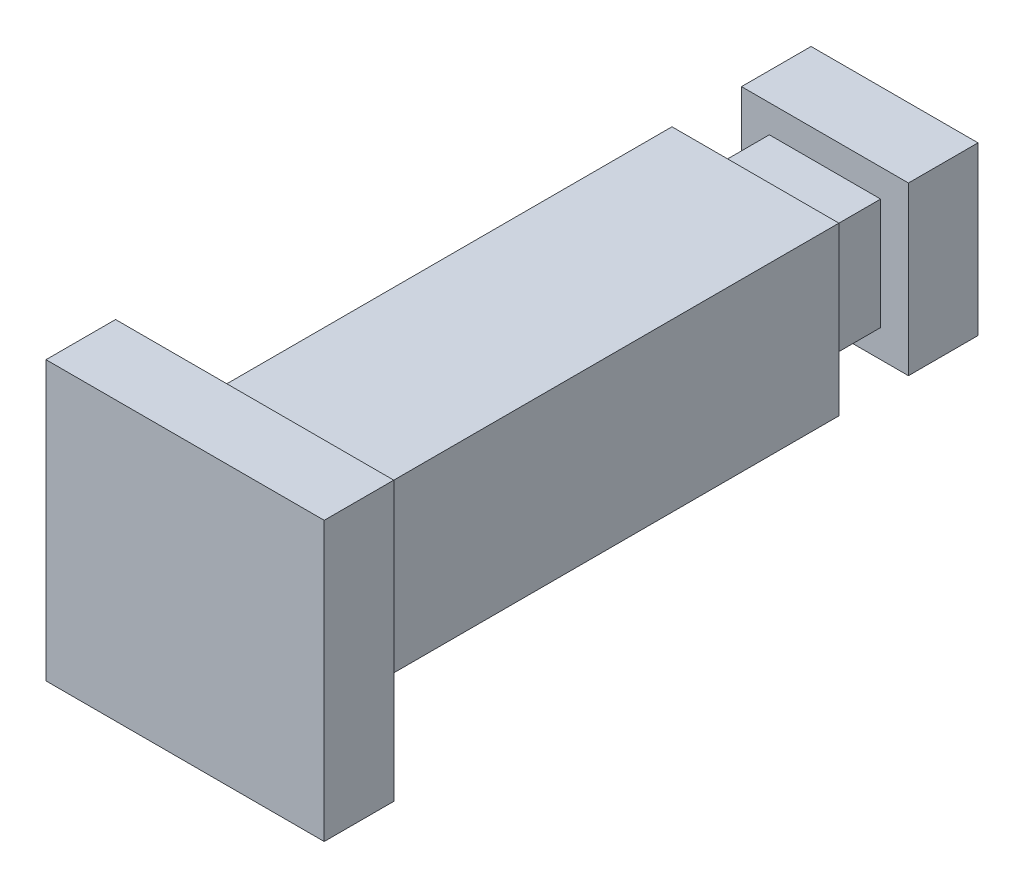
ISO-10303-21;
HEADER;
FILE_DESCRIPTION(('STEP AP214'),'2;1');
FILE_NAME('part.step','',(''),(''),'','','');
FILE_SCHEMA(('AUTOMOTIVE_DESIGN { 1 0 10303 214 1 1 1 1 }'));
ENDSEC;
DATA;
#1=APPLICATION_CONTEXT('core data for automotive mechanical design processes');
#2=APPLICATION_PROTOCOL_DEFINITION('international standard','automotive_design',2000,#1);
#3=PRODUCT_CONTEXT('',#1,'mechanical');
#4=PRODUCT('Part','Part','',(#3));
#5=PRODUCT_RELATED_PRODUCT_CATEGORY('part','',(#4));
#6=PRODUCT_DEFINITION_FORMATION('','',#4);
#7=PRODUCT_DEFINITION_CONTEXT('part definition',#1,'design');
#8=PRODUCT_DEFINITION('design','',#6,#7);
#9=PRODUCT_DEFINITION_SHAPE('','',#8);
#10=(LENGTH_UNIT() NAMED_UNIT(*) SI_UNIT(.MILLI.,.METRE.));
#11=(NAMED_UNIT(*) PLANE_ANGLE_UNIT() SI_UNIT($,.RADIAN.));
#12=(NAMED_UNIT(*) SI_UNIT($,.STERADIAN.) SOLID_ANGLE_UNIT());
#13=UNCERTAINTY_MEASURE_WITH_UNIT(LENGTH_MEASURE(1.E-05),#10,'distance_accuracy_value','');
#14=(GEOMETRIC_REPRESENTATION_CONTEXT(3) GLOBAL_UNCERTAINTY_ASSIGNED_CONTEXT((#13)) GLOBAL_UNIT_ASSIGNED_CONTEXT((#10,
#11,#12)) REPRESENTATION_CONTEXT('',''));
#15=CARTESIAN_POINT('',(0.,0.,0.));
#16=DIRECTION('',(0.,0.,1.));
#17=DIRECTION('',(1.,0.,0.));
#18=AXIS2_PLACEMENT_3D('',#15,#16,#17);
#19=CARTESIAN_POINT('',(0.,0.,0.));
#20=DIRECTION('',(0.,0.,1.));
#21=DIRECTION('',(1.,0.,0.));
#22=AXIS2_PLACEMENT_3D('',#19,#20,#21);
#23=PLANE('',#22);
#24=DIRECTION('',(1.,0.,0.));
#25=VECTOR('',#24,1.);
#26=CARTESIAN_POINT('',(0.,0.,0.));
#27=LINE('',#26,#25);
#28=CARTESIAN_POINT('',(0.,0.,0.));
#29=VERTEX_POINT('',#28);
#30=CARTESIAN_POINT('',(6.,0.,0.));
#31=VERTEX_POINT('',#30);
#32=EDGE_CURVE('E270',#29,#31,#27,.T.);
#33=ORIENTED_EDGE('',*,*,#32,.F.);
#34=DIRECTION('',(0.,1.,0.));
#35=VECTOR('',#34,1.);
#36=CARTESIAN_POINT('',(0.,0.,0.));
#37=LINE('',#36,#35);
#38=CARTESIAN_POINT('',(0.,6.,0.));
#39=VERTEX_POINT('',#38);
#40=EDGE_CURVE('E275',#29,#39,#37,.T.);
#41=ORIENTED_EDGE('',*,*,#40,.T.);
#42=DIRECTION('',(1.,0.,0.));
#43=VECTOR('',#42,1.);
#44=CARTESIAN_POINT('',(0.,6.,0.));
#45=LINE('',#44,#43);
#46=CARTESIAN_POINT('',(6.,6.,0.));
#47=VERTEX_POINT('',#46);
#48=EDGE_CURVE('E294',#39,#47,#45,.T.);
#49=ORIENTED_EDGE('',*,*,#48,.T.);
#50=DIRECTION('',(0.,1.,0.));
#51=VECTOR('',#50,1.);
#52=CARTESIAN_POINT('',(6.,0.,0.));
#53=LINE('',#52,#51);
#54=EDGE_CURVE('E290',#31,#47,#53,.T.);
#55=ORIENTED_EDGE('',*,*,#54,.F.);
#56=EDGE_LOOP('',(#33,#41,#49,#55));
#57=FACE_BOUND('',#56,.T.);
#58=DIRECTION('',(0.,-1.,0.));
#59=VECTOR('',#58,1.);
#60=CARTESIAN_POINT('',(5.,5.,0.));
#61=LINE('',#60,#59);
#62=CARTESIAN_POINT('',(5.,5.,0.));
#63=VERTEX_POINT('',#62);
#64=CARTESIAN_POINT('',(5.,1.,0.));
#65=VERTEX_POINT('',#64);
#66=EDGE_CURVE('E55',#63,#65,#61,.T.);
#67=ORIENTED_EDGE('',*,*,#66,.F.);
#68=DIRECTION('',(1.,0.,0.));
#69=VECTOR('',#68,1.);
#70=CARTESIAN_POINT('',(5.,5.,0.));
#71=LINE('',#70,#69);
#72=CARTESIAN_POINT('',(1.,5.,0.));
#73=VERTEX_POINT('',#72);
#74=EDGE_CURVE('E59',#73,#63,#71,.T.);
#75=ORIENTED_EDGE('',*,*,#74,.F.);
#76=DIRECTION('',(0.,1.,0.));
#77=VECTOR('',#76,1.);
#78=CARTESIAN_POINT('',(1.,5.,0.));
#79=LINE('',#78,#77);
#80=CARTESIAN_POINT('',(1.,1.,0.));
#81=VERTEX_POINT('',#80);
#82=EDGE_CURVE('E208',#81,#73,#79,.T.);
#83=ORIENTED_EDGE('',*,*,#82,.F.);
#84=DIRECTION('',(-1.,0.,0.));
#85=VECTOR('',#84,1.);
#86=CARTESIAN_POINT('',(5.,1.,0.));
#87=LINE('',#86,#85);
#88=EDGE_CURVE('E182',#65,#81,#87,.T.);
#89=ORIENTED_EDGE('',*,*,#88,.F.);
#90=EDGE_LOOP('',(#67,#75,#83,#89));
#91=FACE_BOUND('',#90,.T.);
#92=ADVANCED_FACE('F39',(#57,#91),#23,.F.);
#93=CARTESIAN_POINT('',(0.,0.,18.));
#94=DIRECTION('',(0.,1.,0.));
#95=DIRECTION('',(0.,0.,1.));
#96=AXIS2_PLACEMENT_3D('',#93,#94,#95);
#97=PLANE('',#96);
#98=ORIENTED_EDGE('',*,*,#32,.T.);
#99=DIRECTION('',(0.,0.,-1.));
#100=VECTOR('',#99,1.);
#101=CARTESIAN_POINT('',(6.,0.,18.));
#102=LINE('',#101,#100);
#103=CARTESIAN_POINT('',(6.,0.,18.));
#104=VERTEX_POINT('',#103);
#105=EDGE_CURVE('E11',#104,#31,#102,.T.);
#106=ORIENTED_EDGE('',*,*,#105,.F.);
#107=DIRECTION('',(1.,0.,0.));
#108=VECTOR('',#107,1.);
#109=CARTESIAN_POINT('',(0.,0.,18.));
#110=LINE('',#109,#108);
#111=CARTESIAN_POINT('',(0.,0.,18.));
#112=VERTEX_POINT('',#111);
#113=EDGE_CURVE('E271',#112,#104,#110,.T.);
#114=ORIENTED_EDGE('',*,*,#113,.F.);
#115=DIRECTION('',(0.,0.,-1.));
#116=VECTOR('',#115,1.);
#117=CARTESIAN_POINT('',(0.,0.,18.));
#118=LINE('',#117,#116);
#119=EDGE_CURVE('E286',#112,#29,#118,.T.);
#120=ORIENTED_EDGE('',*,*,#119,.T.);
#121=EDGE_LOOP('',(#98,#106,#114,#120));
#122=FACE_BOUND('',#121,.T.);
#123=ADVANCED_FACE('F41',(#122),#97,.F.);
#124=CARTESIAN_POINT('',(6.,0.,18.));
#125=DIRECTION('',(-1.,0.,0.));
#126=DIRECTION('',(0.,0.,1.));
#127=AXIS2_PLACEMENT_3D('',#124,#125,#126);
#128=PLANE('',#127);
#129=ORIENTED_EDGE('',*,*,#54,.T.);
#130=DIRECTION('',(0.,0.,-1.));
#131=VECTOR('',#130,1.);
#132=CARTESIAN_POINT('',(6.,6.,18.));
#133=LINE('',#132,#131);
#134=CARTESIAN_POINT('',(6.,6.,18.));
#135=VERTEX_POINT('',#134);
#136=EDGE_CURVE('E48',#135,#47,#133,.T.);
#137=ORIENTED_EDGE('',*,*,#136,.F.);
#138=DIRECTION('',(0.,1.,0.));
#139=VECTOR('',#138,1.);
#140=CARTESIAN_POINT('',(6.,0.,18.));
#141=LINE('',#140,#139);
#142=EDGE_CURVE('E274',#104,#135,#141,.T.);
#143=ORIENTED_EDGE('',*,*,#142,.F.);
#144=ORIENTED_EDGE('',*,*,#105,.T.);
#145=EDGE_LOOP('',(#129,#137,#143,#144));
#146=FACE_BOUND('',#145,.T.);
#147=ADVANCED_FACE('F313',(#146),#128,.F.);
#148=CARTESIAN_POINT('',(0.,6.,18.));
#149=DIRECTION('',(0.,1.,0.));
#150=DIRECTION('',(0.,0.,1.));
#151=AXIS2_PLACEMENT_3D('',#148,#149,#150);
#152=PLANE('',#151);
#153=ORIENTED_EDGE('',*,*,#48,.F.);
#154=DIRECTION('',(0.,0.,-1.));
#155=VECTOR('',#154,1.);
#156=CARTESIAN_POINT('',(0.,6.,18.));
#157=LINE('',#156,#155);
#158=CARTESIAN_POINT('',(0.,6.,18.));
#159=VERTEX_POINT('',#158);
#160=EDGE_CURVE('E303',#159,#39,#157,.T.);
#161=ORIENTED_EDGE('',*,*,#160,.F.);
#162=DIRECTION('',(1.,0.,0.));
#163=VECTOR('',#162,1.);
#164=CARTESIAN_POINT('',(0.,6.,18.));
#165=LINE('',#164,#163);
#166=EDGE_CURVE('E278',#159,#135,#165,.T.);
#167=ORIENTED_EDGE('',*,*,#166,.T.);
#168=ORIENTED_EDGE('',*,*,#136,.T.);
#169=EDGE_LOOP('',(#153,#161,#167,#168));
#170=FACE_BOUND('',#169,.T.);
#171=ADVANCED_FACE('F309',(#170),#152,.T.);
#172=CARTESIAN_POINT('',(0.,0.,18.));
#173=DIRECTION('',(-1.,0.,0.));
#174=DIRECTION('',(0.,0.,1.));
#175=AXIS2_PLACEMENT_3D('',#172,#173,#174);
#176=PLANE('',#175);
#177=ORIENTED_EDGE('',*,*,#40,.F.);
#178=ORIENTED_EDGE('',*,*,#119,.F.);
#179=DIRECTION('',(0.,1.,0.));
#180=VECTOR('',#179,1.);
#181=CARTESIAN_POINT('',(0.,0.,18.));
#182=LINE('',#181,#180);
#183=EDGE_CURVE('E282',#112,#159,#182,.T.);
#184=ORIENTED_EDGE('',*,*,#183,.T.);
#185=ORIENTED_EDGE('',*,*,#160,.T.);
#186=EDGE_LOOP('',(#177,#178,#184,#185));
#187=FACE_BOUND('',#186,.T.);
#188=ADVANCED_FACE('F320',(#187),#176,.T.);
#189=CARTESIAN_POINT('',(0.,0.,18.));
#190=DIRECTION('',(0.,0.,1.));
#191=DIRECTION('',(1.,0.,0.));
#192=AXIS2_PLACEMENT_3D('',#189,#190,#191);
#193=PLANE('',#192);
#194=DIRECTION('',(0.,-1.,0.));
#195=VECTOR('',#194,1.);
#196=CARTESIAN_POINT('',(-2.,8.,18.));
#197=LINE('',#196,#195);
#198=CARTESIAN_POINT('',(-2.,8.,18.));
#199=VERTEX_POINT('',#198);
#200=CARTESIAN_POINT('',(-2.,-2.,18.));
#201=VERTEX_POINT('',#200);
#202=EDGE_CURVE('E228',#199,#201,#197,.T.);
#203=ORIENTED_EDGE('',*,*,#202,.F.);
#204=DIRECTION('',(-1.,0.,0.));
#205=VECTOR('',#204,1.);
#206=CARTESIAN_POINT('',(-2.,8.,18.));
#207=LINE('',#206,#205);
#208=CARTESIAN_POINT('',(8.,8.,18.));
#209=VERTEX_POINT('',#208);
#210=EDGE_CURVE('E234',#209,#199,#207,.T.);
#211=ORIENTED_EDGE('',*,*,#210,.F.);
#212=DIRECTION('',(0.,1.,0.));
#213=VECTOR('',#212,1.);
#214=CARTESIAN_POINT('',(8.,8.,18.));
#215=LINE('',#214,#213);
#216=CARTESIAN_POINT('',(8.,-2.,18.));
#217=VERTEX_POINT('',#216);
#218=EDGE_CURVE('E250',#217,#209,#215,.T.);
#219=ORIENTED_EDGE('',*,*,#218,.F.);
#220=DIRECTION('',(1.,0.,0.));
#221=VECTOR('',#220,1.);
#222=CARTESIAN_POINT('',(-2.,-2.,18.));
#223=LINE('',#222,#221);
#224=EDGE_CURVE('E247',#201,#217,#223,.T.);
#225=ORIENTED_EDGE('',*,*,#224,.F.);
#226=EDGE_LOOP('',(#203,#211,#219,#225));
#227=FACE_BOUND('',#226,.T.);
#228=ORIENTED_EDGE('',*,*,#183,.F.);
#229=ORIENTED_EDGE('',*,*,#113,.T.);
#230=ORIENTED_EDGE('',*,*,#142,.T.);
#231=ORIENTED_EDGE('',*,*,#166,.F.);
#232=EDGE_LOOP('',(#228,#229,#230,#231));
#233=FACE_BOUND('',#232,.T.);
#234=ADVANCED_FACE('F323',(#227,#233),#193,.F.);
#235=CARTESIAN_POINT('',(-2.,8.,20.5));
#236=DIRECTION('',(1.,0.,0.));
#237=DIRECTION('',(0.,1.,0.));
#238=AXIS2_PLACEMENT_3D('',#235,#236,#237);
#239=PLANE('',#238);
#240=ORIENTED_EDGE('',*,*,#202,.T.);
#241=DIRECTION('',(0.,0.,-1.));
#242=VECTOR('',#241,1.);
#243=CARTESIAN_POINT('',(-2.,-2.,20.5));
#244=LINE('',#243,#242);
#245=CARTESIAN_POINT('',(-2.,-2.,20.5));
#246=VERTEX_POINT('',#245);
#247=EDGE_CURVE('E266',#246,#201,#244,.T.);
#248=ORIENTED_EDGE('',*,*,#247,.F.);
#249=DIRECTION('',(0.,-1.,0.));
#250=VECTOR('',#249,1.);
#251=CARTESIAN_POINT('',(-2.,8.,20.5));
#252=LINE('',#251,#250);
#253=CARTESIAN_POINT('',(-2.,8.,20.5));
#254=VERTEX_POINT('',#253);
#255=EDGE_CURVE('E229',#254,#246,#252,.T.);
#256=ORIENTED_EDGE('',*,*,#255,.F.);
#257=DIRECTION('',(0.,0.,-1.));
#258=VECTOR('',#257,1.);
#259=CARTESIAN_POINT('',(-2.,8.,20.5));
#260=LINE('',#259,#258);
#261=EDGE_CURVE('E243',#254,#199,#260,.T.);
#262=ORIENTED_EDGE('',*,*,#261,.T.);
#263=EDGE_LOOP('',(#240,#248,#256,#262));
#264=FACE_BOUND('',#263,.T.);
#265=ADVANCED_FACE('F335',(#264),#239,.F.);
#266=CARTESIAN_POINT('',(-2.,-2.,20.5));
#267=DIRECTION('',(0.,1.,0.));
#268=DIRECTION('',(-1.,0.,0.));
#269=AXIS2_PLACEMENT_3D('',#266,#267,#268);
#270=PLANE('',#269);
#271=ORIENTED_EDGE('',*,*,#224,.T.);
#272=DIRECTION('',(0.,0.,-1.));
#273=VECTOR('',#272,1.);
#274=CARTESIAN_POINT('',(8.,-2.,20.5));
#275=LINE('',#274,#273);
#276=CARTESIAN_POINT('',(8.,-2.,20.5));
#277=VERTEX_POINT('',#276);
#278=EDGE_CURVE('E262',#277,#217,#275,.T.);
#279=ORIENTED_EDGE('',*,*,#278,.F.);
#280=DIRECTION('',(1.,0.,0.));
#281=VECTOR('',#280,1.);
#282=CARTESIAN_POINT('',(-2.,-2.,20.5));
#283=LINE('',#282,#281);
#284=EDGE_CURVE('E233',#246,#277,#283,.T.);
#285=ORIENTED_EDGE('',*,*,#284,.F.);
#286=ORIENTED_EDGE('',*,*,#247,.T.);
#287=EDGE_LOOP('',(#271,#279,#285,#286));
#288=FACE_BOUND('',#287,.T.);
#289=ADVANCED_FACE('F361',(#288),#270,.F.);
#290=CARTESIAN_POINT('',(8.,8.,20.5));
#291=DIRECTION('',(-1.,0.,0.));
#292=DIRECTION('',(0.,-1.,0.));
#293=AXIS2_PLACEMENT_3D('',#290,#291,#292);
#294=PLANE('',#293);
#295=ORIENTED_EDGE('',*,*,#218,.T.);
#296=DIRECTION('',(0.,0.,-1.));
#297=VECTOR('',#296,1.);
#298=CARTESIAN_POINT('',(8.,8.,20.5));
#299=LINE('',#298,#297);
#300=CARTESIAN_POINT('',(8.,8.,20.5));
#301=VERTEX_POINT('',#300);
#302=EDGE_CURVE('E258',#301,#209,#299,.T.);
#303=ORIENTED_EDGE('',*,*,#302,.F.);
#304=DIRECTION('',(0.,1.,0.));
#305=VECTOR('',#304,1.);
#306=CARTESIAN_POINT('',(8.,8.,20.5));
#307=LINE('',#306,#305);
#308=EDGE_CURVE('E237',#277,#301,#307,.T.);
#309=ORIENTED_EDGE('',*,*,#308,.F.);
#310=ORIENTED_EDGE('',*,*,#278,.T.);
#311=EDGE_LOOP('',(#295,#303,#309,#310));
#312=FACE_BOUND('',#311,.T.);
#313=ADVANCED_FACE('F368',(#312),#294,.F.);
#314=CARTESIAN_POINT('',(-2.,8.,20.5));
#315=DIRECTION('',(0.,-1.,0.));
#316=DIRECTION('',(0.,0.,-1.));
#317=AXIS2_PLACEMENT_3D('',#314,#315,#316);
#318=PLANE('',#317);
#319=ORIENTED_EDGE('',*,*,#210,.T.);
#320=ORIENTED_EDGE('',*,*,#261,.F.);
#321=DIRECTION('',(-1.,0.,0.));
#322=VECTOR('',#321,1.);
#323=CARTESIAN_POINT('',(-2.,8.,20.5));
#324=LINE('',#323,#322);
#325=EDGE_CURVE('E240',#301,#254,#324,.T.);
#326=ORIENTED_EDGE('',*,*,#325,.F.);
#327=ORIENTED_EDGE('',*,*,#302,.T.);
#328=EDGE_LOOP('',(#319,#320,#326,#327));
#329=FACE_BOUND('',#328,.T.);
#330=ADVANCED_FACE('F375',(#329),#318,.F.);
#331=CARTESIAN_POINT('',(0.,0.,20.5));
#332=DIRECTION('',(0.,0.,1.));
#333=DIRECTION('',(1.,0.,0.));
#334=AXIS2_PLACEMENT_3D('',#331,#332,#333);
#335=PLANE('',#334);
#336=ORIENTED_EDGE('',*,*,#255,.T.);
#337=ORIENTED_EDGE('',*,*,#284,.T.);
#338=ORIENTED_EDGE('',*,*,#308,.T.);
#339=ORIENTED_EDGE('',*,*,#325,.T.);
#340=EDGE_LOOP('',(#336,#337,#338,#339));
#341=FACE_BOUND('',#340,.T.);
#342=ADVANCED_FACE('F383',(#341),#335,.T.);
#343=CARTESIAN_POINT('',(5.,5.,-2.5));
#344=DIRECTION('',(-1.,0.,0.));
#345=DIRECTION('',(0.,0.,1.));
#346=AXIS2_PLACEMENT_3D('',#343,#344,#345);
#347=PLANE('',#346);
#348=ORIENTED_EDGE('',*,*,#66,.T.);
#349=DIRECTION('',(0.,0.,1.));
#350=VECTOR('',#349,1.);
#351=CARTESIAN_POINT('',(5.,1.,-2.5));
#352=LINE('',#351,#350);
#353=CARTESIAN_POINT('',(5.,1.,-2.5));
#354=VERTEX_POINT('',#353);
#355=EDGE_CURVE('E224',#354,#65,#352,.T.);
#356=ORIENTED_EDGE('',*,*,#355,.F.);
#357=DIRECTION('',(0.,-1.,0.));
#358=VECTOR('',#357,1.);
#359=CARTESIAN_POINT('',(5.,5.,-2.5));
#360=LINE('',#359,#358);
#361=CARTESIAN_POINT('',(5.,5.,-2.5));
#362=VERTEX_POINT('',#361);
#363=EDGE_CURVE('E188',#362,#354,#360,.T.);
#364=ORIENTED_EDGE('',*,*,#363,.F.);
#365=DIRECTION('',(0.,0.,1.));
#366=VECTOR('',#365,1.);
#367=CARTESIAN_POINT('',(5.,5.,-2.5));
#368=LINE('',#367,#366);
#369=EDGE_CURVE('E203',#362,#63,#368,.T.);
#370=ORIENTED_EDGE('',*,*,#369,.T.);
#371=EDGE_LOOP('',(#348,#356,#364,#370));
#372=FACE_BOUND('',#371,.T.);
#373=ADVANCED_FACE('F391',(#372),#347,.F.);
#374=CARTESIAN_POINT('',(5.,1.,-2.5));
#375=DIRECTION('',(0.,1.,0.));
#376=DIRECTION('',(-1.,0.,0.));
#377=AXIS2_PLACEMENT_3D('',#374,#375,#376);
#378=PLANE('',#377);
#379=ORIENTED_EDGE('',*,*,#88,.T.);
#380=DIRECTION('',(0.,0.,1.));
#381=VECTOR('',#380,1.);
#382=CARTESIAN_POINT('',(1.,1.,-2.5));
#383=LINE('',#382,#381);
#384=CARTESIAN_POINT('',(1.,1.,-2.5));
#385=VERTEX_POINT('',#384);
#386=EDGE_CURVE('E220',#385,#81,#383,.T.);
#387=ORIENTED_EDGE('',*,*,#386,.F.);
#388=DIRECTION('',(-1.,0.,0.));
#389=VECTOR('',#388,1.);
#390=CARTESIAN_POINT('',(5.,1.,-2.5));
#391=LINE('',#390,#389);
#392=EDGE_CURVE('E192',#354,#385,#391,.T.);
#393=ORIENTED_EDGE('',*,*,#392,.F.);
#394=ORIENTED_EDGE('',*,*,#355,.T.);
#395=EDGE_LOOP('',(#379,#387,#393,#394));
#396=FACE_BOUND('',#395,.T.);
#397=ADVANCED_FACE('F399',(#396),#378,.F.);
#398=CARTESIAN_POINT('',(1.,5.,-2.5));
#399=DIRECTION('',(1.,0.,0.));
#400=DIRECTION('',(0.,0.,-1.));
#401=AXIS2_PLACEMENT_3D('',#398,#399,#400);
#402=PLANE('',#401);
#403=ORIENTED_EDGE('',*,*,#82,.T.);
#404=DIRECTION('',(0.,0.,1.));
#405=VECTOR('',#404,1.);
#406=CARTESIAN_POINT('',(1.,5.,-2.5));
#407=LINE('',#406,#405);
#408=CARTESIAN_POINT('',(1.,5.,-2.5));
#409=VERTEX_POINT('',#408);
#410=EDGE_CURVE('E216',#409,#73,#407,.T.);
#411=ORIENTED_EDGE('',*,*,#410,.F.);
#412=DIRECTION('',(0.,1.,0.));
#413=VECTOR('',#412,1.);
#414=CARTESIAN_POINT('',(1.,5.,-2.5));
#415=LINE('',#414,#413);
#416=EDGE_CURVE('E196',#385,#409,#415,.T.);
#417=ORIENTED_EDGE('',*,*,#416,.F.);
#418=ORIENTED_EDGE('',*,*,#386,.T.);
#419=EDGE_LOOP('',(#403,#411,#417,#418));
#420=FACE_BOUND('',#419,.T.);
#421=ADVANCED_FACE('F407',(#420),#402,.F.);
#422=CARTESIAN_POINT('',(5.,5.,-2.5));
#423=DIRECTION('',(0.,-1.,0.));
#424=DIRECTION('',(1.,0.,0.));
#425=AXIS2_PLACEMENT_3D('',#422,#423,#424);
#426=PLANE('',#425);
#427=ORIENTED_EDGE('',*,*,#74,.T.);
#428=ORIENTED_EDGE('',*,*,#369,.F.);
#429=DIRECTION('',(1.,0.,0.));
#430=VECTOR('',#429,1.);
#431=CARTESIAN_POINT('',(5.,5.,-2.5));
#432=LINE('',#431,#430);
#433=EDGE_CURVE('E200',#409,#362,#432,.T.);
#434=ORIENTED_EDGE('',*,*,#433,.F.);
#435=ORIENTED_EDGE('',*,*,#410,.T.);
#436=EDGE_LOOP('',(#427,#428,#434,#435));
#437=FACE_BOUND('',#436,.T.);
#438=ADVANCED_FACE('F415',(#437),#426,.F.);
#439=CARTESIAN_POINT('',(0.,0.,-2.5));
#440=DIRECTION('',(0.,0.,-1.));
#441=DIRECTION('',(-1.,0.,0.));
#442=AXIS2_PLACEMENT_3D('',#439,#440,#441);
#443=PLANE('',#442);
#444=DIRECTION('',(0.,-1.,0.));
#445=VECTOR('',#444,1.);
#446=CARTESIAN_POINT('',(6.,6.,-2.5));
#447=LINE('',#446,#445);
#448=CARTESIAN_POINT('',(6.,6.,-2.5));
#449=VERTEX_POINT('',#448);
#450=CARTESIAN_POINT('',(6.,0.,-2.5));
#451=VERTEX_POINT('',#450);
#452=EDGE_CURVE('E177',#449,#451,#447,.T.);
#453=ORIENTED_EDGE('',*,*,#452,.F.);
#454=DIRECTION('',(1.,0.,0.));
#455=VECTOR('',#454,1.);
#456=CARTESIAN_POINT('',(6.,6.,-2.5));
#457=LINE('',#456,#455);
#458=CARTESIAN_POINT('',(0.,6.,-2.5));
#459=VERTEX_POINT('',#458);
#460=EDGE_CURVE('E173',#459,#449,#457,.T.);
#461=ORIENTED_EDGE('',*,*,#460,.F.);
#462=DIRECTION('',(0.,1.,0.));
#463=VECTOR('',#462,1.);
#464=CARTESIAN_POINT('',(0.,6.,-2.5));
#465=LINE('',#464,#463);
#466=CARTESIAN_POINT('',(0.,0.,-2.5));
#467=VERTEX_POINT('',#466);
#468=EDGE_CURVE('E522',#467,#459,#465,.T.);
#469=ORIENTED_EDGE('',*,*,#468,.F.);
#470=DIRECTION('',(-1.,0.,0.));
#471=VECTOR('',#470,1.);
#472=CARTESIAN_POINT('',(6.,0.,-2.5));
#473=LINE('',#472,#471);
#474=EDGE_CURVE('E527',#451,#467,#473,.T.);
#475=ORIENTED_EDGE('',*,*,#474,.F.);
#476=EDGE_LOOP('',(#453,#461,#469,#475));
#477=FACE_BOUND('',#476,.T.);
#478=ORIENTED_EDGE('',*,*,#433,.T.);
#479=ORIENTED_EDGE('',*,*,#363,.T.);
#480=ORIENTED_EDGE('',*,*,#392,.T.);
#481=ORIENTED_EDGE('',*,*,#416,.T.);
#482=EDGE_LOOP('',(#478,#479,#480,#481));
#483=FACE_BOUND('',#482,.T.);
#484=ADVANCED_FACE('F423',(#477,#483),#443,.F.);
#485=CARTESIAN_POINT('',(6.,6.,-5.));
#486=DIRECTION('',(-1.,0.,0.));
#487=DIRECTION('',(0.,0.,1.));
#488=AXIS2_PLACEMENT_3D('',#485,#486,#487);
#489=PLANE('',#488);
#490=ORIENTED_EDGE('',*,*,#452,.T.);
#491=DIRECTION('',(0.,0.,1.));
#492=VECTOR('',#491,1.);
#493=CARTESIAN_POINT('',(6.,0.,-5.));
#494=LINE('',#493,#492);
#495=CARTESIAN_POINT('',(6.,0.,-5.));
#496=VERTEX_POINT('',#495);
#497=EDGE_CURVE('E155',#496,#451,#494,.T.);
#498=ORIENTED_EDGE('',*,*,#497,.F.);
#499=DIRECTION('',(0.,-1.,0.));
#500=VECTOR('',#499,1.);
#501=CARTESIAN_POINT('',(6.,6.,-5.));
#502=LINE('',#501,#500);
#503=CARTESIAN_POINT('',(6.,6.,-5.));
#504=VERTEX_POINT('',#503);
#505=EDGE_CURVE('E163',#504,#496,#502,.T.);
#506=ORIENTED_EDGE('',*,*,#505,.F.);
#507=DIRECTION('',(0.,0.,1.));
#508=VECTOR('',#507,1.);
#509=CARTESIAN_POINT('',(6.,6.,-5.));
#510=LINE('',#509,#508);
#511=EDGE_CURVE('E518',#504,#449,#510,.T.);
#512=ORIENTED_EDGE('',*,*,#511,.T.);
#513=EDGE_LOOP('',(#490,#498,#506,#512));
#514=FACE_BOUND('',#513,.T.);
#515=ADVANCED_FACE('F175',(#514),#489,.F.);
#516=CARTESIAN_POINT('',(6.,0.,-5.));
#517=DIRECTION('',(0.,1.,0.));
#518=DIRECTION('',(0.,0.,1.));
#519=AXIS2_PLACEMENT_3D('',#516,#517,#518);
#520=PLANE('',#519);
#521=ORIENTED_EDGE('',*,*,#474,.T.);
#522=DIRECTION('',(0.,0.,1.));
#523=VECTOR('',#522,1.);
#524=CARTESIAN_POINT('',(0.,0.,-5.));
#525=LINE('',#524,#523);
#526=CARTESIAN_POINT('',(0.,0.,-5.));
#527=VERTEX_POINT('',#526);
#528=EDGE_CURVE('E158',#527,#467,#525,.T.);
#529=ORIENTED_EDGE('',*,*,#528,.F.);
#530=DIRECTION('',(-1.,0.,0.));
#531=VECTOR('',#530,1.);
#532=CARTESIAN_POINT('',(6.,0.,-5.));
#533=LINE('',#532,#531);
#534=EDGE_CURVE('E151',#496,#527,#533,.T.);
#535=ORIENTED_EDGE('',*,*,#534,.F.);
#536=ORIENTED_EDGE('',*,*,#497,.T.);
#537=EDGE_LOOP('',(#521,#529,#535,#536));
#538=FACE_BOUND('',#537,.T.);
#539=ADVANCED_FACE('F153',(#538),#520,.F.);
#540=CARTESIAN_POINT('',(0.,6.,-5.));
#541=DIRECTION('',(1.,0.,0.));
#542=DIRECTION('',(0.,0.,-1.));
#543=AXIS2_PLACEMENT_3D('',#540,#541,#542);
#544=PLANE('',#543);
#545=ORIENTED_EDGE('',*,*,#468,.T.);
#546=DIRECTION('',(0.,0.,1.));
#547=VECTOR('',#546,1.);
#548=CARTESIAN_POINT('',(0.,6.,-5.));
#549=LINE('',#548,#547);
#550=CARTESIAN_POINT('',(0.,6.,-5.));
#551=VERTEX_POINT('',#550);
#552=EDGE_CURVE('E184',#551,#459,#549,.T.);
#553=ORIENTED_EDGE('',*,*,#552,.F.);
#554=DIRECTION('',(0.,1.,0.));
#555=VECTOR('',#554,1.);
#556=CARTESIAN_POINT('',(0.,6.,-5.));
#557=LINE('',#556,#555);
#558=EDGE_CURVE('E162',#527,#551,#557,.T.);
#559=ORIENTED_EDGE('',*,*,#558,.F.);
#560=ORIENTED_EDGE('',*,*,#528,.T.);
#561=EDGE_LOOP('',(#545,#553,#559,#560));
#562=FACE_BOUND('',#561,.T.);
#563=ADVANCED_FACE('F444',(#562),#544,.F.);
#564=CARTESIAN_POINT('',(6.,6.,-5.));
#565=DIRECTION('',(0.,-1.,0.));
#566=DIRECTION('',(0.,0.,-1.));
#567=AXIS2_PLACEMENT_3D('',#564,#565,#566);
#568=PLANE('',#567);
#569=ORIENTED_EDGE('',*,*,#460,.T.);
#570=ORIENTED_EDGE('',*,*,#511,.F.);
#571=DIRECTION('',(1.,0.,0.));
#572=VECTOR('',#571,1.);
#573=CARTESIAN_POINT('',(6.,6.,-5.));
#574=LINE('',#573,#572);
#575=EDGE_CURVE('E168',#551,#504,#574,.T.);
#576=ORIENTED_EDGE('',*,*,#575,.F.);
#577=ORIENTED_EDGE('',*,*,#552,.T.);
#578=EDGE_LOOP('',(#569,#570,#576,#577));
#579=FACE_BOUND('',#578,.T.);
#580=ADVANCED_FACE('F451',(#579),#568,.F.);
#581=CARTESIAN_POINT('',(0.,0.,-5.));
#582=DIRECTION('',(0.,0.,-1.));
#583=DIRECTION('',(-1.,0.,0.));
#584=AXIS2_PLACEMENT_3D('',#581,#582,#583);
#585=PLANE('',#584);
#586=ORIENTED_EDGE('',*,*,#505,.T.);
#587=ORIENTED_EDGE('',*,*,#534,.T.);
#588=ORIENTED_EDGE('',*,*,#558,.T.);
#589=ORIENTED_EDGE('',*,*,#575,.T.);
#590=EDGE_LOOP('',(#586,#587,#588,#589));
#591=FACE_BOUND('',#590,.T.);
#592=ADVANCED_FACE('F166',(#591),#585,.T.);
#593=CLOSED_SHELL('',(#92,#123,#147,#171,#188,#234,#265,#289,#313,#330,#342,#373,#397,#421,#438,
#484,#515,#539,#563,#580,#592));
#594=MANIFOLD_SOLID_BREP('B2',#593);
#595=ADVANCED_BREP_SHAPE_REPRESENTATION('',(#18,#594),#14);
#596=SHAPE_DEFINITION_REPRESENTATION(#9,#595);
ENDSEC;
END-ISO-10303-21;
